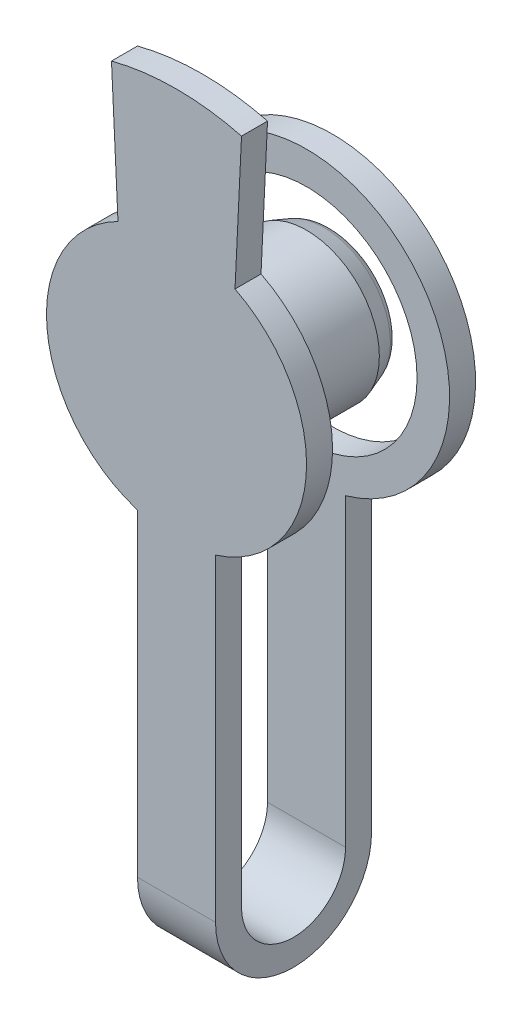
ISO-10303-21;
HEADER;
FILE_DESCRIPTION(('STEP AP214'),'2;1');
FILE_NAME('part.step','',(''),(''),'','','');
FILE_SCHEMA(('AUTOMOTIVE_DESIGN { 1 0 10303 214 1 1 1 1 }'));
ENDSEC;
DATA;
#1=APPLICATION_CONTEXT('core data for automotive mechanical design processes');
#2=APPLICATION_PROTOCOL_DEFINITION('international standard','automotive_design',2000,#1);
#3=PRODUCT_CONTEXT('',#1,'mechanical');
#4=PRODUCT('Part','Part','',(#3));
#5=PRODUCT_RELATED_PRODUCT_CATEGORY('part','',(#4));
#6=PRODUCT_DEFINITION_FORMATION('','',#4);
#7=PRODUCT_DEFINITION_CONTEXT('part definition',#1,'design');
#8=PRODUCT_DEFINITION('design','',#6,#7);
#9=PRODUCT_DEFINITION_SHAPE('','',#8);
#10=(LENGTH_UNIT() NAMED_UNIT(*) SI_UNIT(.MILLI.,.METRE.));
#11=(NAMED_UNIT(*) PLANE_ANGLE_UNIT() SI_UNIT($,.RADIAN.));
#12=(NAMED_UNIT(*) SI_UNIT($,.STERADIAN.) SOLID_ANGLE_UNIT());
#13=UNCERTAINTY_MEASURE_WITH_UNIT(LENGTH_MEASURE(1.E-05),#10,'distance_accuracy_value','');
#14=(GEOMETRIC_REPRESENTATION_CONTEXT(3) GLOBAL_UNCERTAINTY_ASSIGNED_CONTEXT((#13)) GLOBAL_UNIT_ASSIGNED_CONTEXT((#10,
#11,#12)) REPRESENTATION_CONTEXT('',''));
#15=CARTESIAN_POINT('',(0.,0.,0.));
#16=DIRECTION('',(0.,0.,1.));
#17=DIRECTION('',(1.,0.,0.));
#18=AXIS2_PLACEMENT_3D('',#15,#16,#17);
#19=CARTESIAN_POINT('',(0.,0.,5.));
#20=DIRECTION('',(0.,0.,-1.));
#21=DIRECTION('',(-1.,0.,0.));
#22=AXIS2_PLACEMENT_3D('',#19,#20,#21);
#23=CYLINDRICAL_SURFACE('',#22,5.);
#24=CARTESIAN_POINT('',(0.,0.,5.));
#25=DIRECTION('',(0.,0.,1.));
#26=DIRECTION('',(1.,0.,0.));
#27=AXIS2_PLACEMENT_3D('',#24,#25,#26);
#28=CIRCLE('',#27,5.);
#29=CARTESIAN_POINT('',(1.5,-4.76969600708473,5.));
#30=VERTEX_POINT('',#29);
#31=CARTESIAN_POINT('',(2.25,4.46514277487294,5.));
#32=VERTEX_POINT('',#31);
#33=EDGE_CURVE('E32',#30,#32,#28,.T.);
#34=ORIENTED_EDGE('',*,*,#33,.F.);
#35=DIRECTION('',(0.,0.,-1.));
#36=VECTOR('',#35,1.);
#37=CARTESIAN_POINT('',(1.5,-4.76969600708473,5.));
#38=LINE('',#37,#36);
#39=CARTESIAN_POINT('',(1.5,-4.76969600708473,4.));
#40=VERTEX_POINT('',#39);
#41=EDGE_CURVE('E176',#30,#40,#38,.T.);
#42=ORIENTED_EDGE('',*,*,#41,.T.);
#43=CARTESIAN_POINT('',(0.,0.,4.));
#44=DIRECTION('',(0.,0.,1.));
#45=DIRECTION('',(1.,0.,0.));
#46=AXIS2_PLACEMENT_3D('',#43,#44,#45);
#47=CIRCLE('',#46,5.);
#48=CARTESIAN_POINT('',(2.25,4.46514277487294,4.));
#49=VERTEX_POINT('',#48);
#50=EDGE_CURVE('E210',#40,#49,#47,.T.);
#51=ORIENTED_EDGE('',*,*,#50,.T.);
#52=DIRECTION('',(0.,0.,1.));
#53=VECTOR('',#52,1.);
#54=CARTESIAN_POINT('',(2.25,4.46514277487294,-3.45886348598372));
#55=LINE('',#54,#53);
#56=EDGE_CURVE('E197',#49,#32,#55,.T.);
#57=ORIENTED_EDGE('',*,*,#56,.T.);
#58=EDGE_LOOP('',(#34,#42,#51,#57));
#59=FACE_BOUND('',#58,.T.);
#60=ADVANCED_FACE('F17',(#59),#23,.T.);
#61=CARTESIAN_POINT('',(0.,0.,-1.));
#62=DIRECTION('',(0.,0.,1.));
#63=DIRECTION('',(1.,0.,0.));
#64=AXIS2_PLACEMENT_3D('',#61,#62,#63);
#65=CYLINDRICAL_SURFACE('',#64,2.8);
#66=CARTESIAN_POINT('',(0.,0.,0.));
#67=DIRECTION('',(0.,0.,1.));
#68=DIRECTION('',(1.,0.,0.));
#69=AXIS2_PLACEMENT_3D('',#66,#67,#68);
#70=CIRCLE('',#69,2.8);
#71=CARTESIAN_POINT('',(2.8,0.,0.));
#72=VERTEX_POINT('',#71);
#73=EDGE_CURVE('E222',#72,#72,#70,.T.);
#74=ORIENTED_EDGE('',*,*,#73,.T.);
#75=EDGE_LOOP('',(#74));
#76=FACE_BOUND('',#75,.T.);
#77=CARTESIAN_POINT('',(0.,0.,4.));
#78=DIRECTION('',(0.,0.,1.));
#79=DIRECTION('',(1.,0.,0.));
#80=AXIS2_PLACEMENT_3D('',#77,#78,#79);
#81=CIRCLE('',#80,2.8);
#82=CARTESIAN_POINT('',(2.8,0.,4.));
#83=VERTEX_POINT('',#82);
#84=EDGE_CURVE('E217',#83,#83,#81,.T.);
#85=ORIENTED_EDGE('',*,*,#84,.F.);
#86=EDGE_LOOP('',(#85));
#87=FACE_BOUND('',#86,.T.);
#88=ADVANCED_FACE('F244',(#76,#87),#65,.T.);
#89=CARTESIAN_POINT('',(0.,0.,-1.));
#90=DIRECTION('',(0.,0.,1.));
#91=DIRECTION('',(1.,0.,0.));
#92=AXIS2_PLACEMENT_3D('',#89,#90,#91);
#93=PLANE('',#92);
#94=CARTESIAN_POINT('',(0.,0.,-1.));
#95=DIRECTION('',(0.,0.,1.));
#96=DIRECTION('',(1.,0.,0.));
#97=AXIS2_PLACEMENT_3D('',#94,#95,#96);
#98=CIRCLE('',#97,2.08592599662894);
#99=CARTESIAN_POINT('',(2.08592599662894,0.,-1.));
#100=VERTEX_POINT('',#99);
#101=EDGE_CURVE('E25',#100,#100,#98,.F.);
#102=ORIENTED_EDGE('',*,*,#101,.T.);
#103=EDGE_LOOP('',(#102));
#104=FACE_BOUND('',#103,.T.);
#105=CARTESIAN_POINT('',(0.,0.,-1.));
#106=DIRECTION('',(0.,0.,1.));
#107=DIRECTION('',(1.,0.,0.));
#108=AXIS2_PLACEMENT_3D('',#105,#106,#107);
#109=CIRCLE('',#108,1.5);
#110=CARTESIAN_POINT('',(1.5,0.,-1.));
#111=VERTEX_POINT('',#110);
#112=EDGE_CURVE('E214',#111,#111,#109,.T.);
#113=ORIENTED_EDGE('',*,*,#112,.T.);
#114=EDGE_LOOP('',(#113));
#115=FACE_BOUND('',#114,.T.);
#116=ADVANCED_FACE('F226',(#104,#115),#93,.F.);
#117=CARTESIAN_POINT('',(0.,0.,-1.));
#118=DIRECTION('',(0.,0.,1.));
#119=DIRECTION('',(1.,0.,0.));
#120=AXIS2_PLACEMENT_3D('',#117,#118,#119);
#121=CYLINDRICAL_SURFACE('',#120,1.5);
#122=ORIENTED_EDGE('',*,*,#112,.F.);
#123=EDGE_LOOP('',(#122));
#124=FACE_BOUND('',#123,.T.);
#125=CARTESIAN_POINT('',(0.,0.,4.));
#126=DIRECTION('',(0.,0.,1.));
#127=DIRECTION('',(1.,0.,0.));
#128=AXIS2_PLACEMENT_3D('',#125,#126,#127);
#129=CIRCLE('',#128,1.5);
#130=CARTESIAN_POINT('',(1.5,0.,4.));
#131=VERTEX_POINT('',#130);
#132=EDGE_CURVE('E209',#131,#131,#129,.F.);
#133=ORIENTED_EDGE('',*,*,#132,.F.);
#134=EDGE_LOOP('',(#133));
#135=FACE_BOUND('',#134,.T.);
#136=ADVANCED_FACE('F270',(#124,#135),#121,.F.);
#137=CARTESIAN_POINT('',(0.,0.,4.));
#138=DIRECTION('',(0.,0.,1.));
#139=DIRECTION('',(1.,0.,0.));
#140=AXIS2_PLACEMENT_3D('',#137,#138,#139);
#141=PLANE('',#140);
#142=ORIENTED_EDGE('',*,*,#132,.T.);
#143=EDGE_LOOP('',(#142));
#144=FACE_BOUND('',#143,.T.);
#145=ADVANCED_FACE('F256',(#144),#141,.F.);
#146=CARTESIAN_POINT('',(-2.25,4.46514277487294,4.));
#147=VERTEX_POINT('',#146);
#148=CARTESIAN_POINT('',(-1.5,-4.76969600708473,4.));
#149=VERTEX_POINT('',#148);
#150=EDGE_CURVE('E211',#147,#149,#47,.T.);
#151=ORIENTED_EDGE('',*,*,#150,.T.);
#152=DIRECTION('',(0.,0.,-1.));
#153=VECTOR('',#152,1.);
#154=CARTESIAN_POINT('',(-1.5,-4.76969600708473,5.));
#155=LINE('',#154,#153);
#156=CARTESIAN_POINT('',(-1.5,-4.76969600708473,5.));
#157=VERTEX_POINT('',#156);
#158=EDGE_CURVE('E37',#149,#157,#155,.F.);
#159=ORIENTED_EDGE('',*,*,#158,.T.);
#160=CARTESIAN_POINT('',(-2.25,4.46514277487294,5.));
#161=VERTEX_POINT('',#160);
#162=EDGE_CURVE('E208',#161,#157,#28,.T.);
#163=ORIENTED_EDGE('',*,*,#162,.F.);
#164=DIRECTION('',(0.,0.,1.));
#165=VECTOR('',#164,1.);
#166=CARTESIAN_POINT('',(-2.25,4.46514277487294,-3.45886348598372));
#167=LINE('',#166,#165);
#168=EDGE_CURVE('E186',#147,#161,#167,.T.);
#169=ORIENTED_EDGE('',*,*,#168,.F.);
#170=EDGE_LOOP('',(#151,#159,#163,#169));
#171=FACE_BOUND('',#170,.T.);
#172=ADVANCED_FACE('F250',(#171),#23,.T.);
#173=CARTESIAN_POINT('',(0.,0.,5.));
#174=DIRECTION('',(0.,0.,1.));
#175=DIRECTION('',(1.,0.,0.));
#176=AXIS2_PLACEMENT_3D('',#173,#174,#175);
#177=PLANE('',#176);
#178=ORIENTED_EDGE('',*,*,#162,.T.);
#179=DIRECTION('',(0.,-1.,0.));
#180=VECTOR('',#179,1.);
#181=CARTESIAN_POINT('',(-1.5,-7.,5.));
#182=LINE('',#181,#180);
#183=CARTESIAN_POINT('',(-1.5,-17.,5.));
#184=VERTEX_POINT('',#183);
#185=EDGE_CURVE('E173',#157,#184,#182,.T.);
#186=ORIENTED_EDGE('',*,*,#185,.T.);
#187=DIRECTION('',(1.,0.,0.));
#188=VECTOR('',#187,1.);
#189=CARTESIAN_POINT('',(-16.2732867026942,-17.,5.));
#190=LINE('',#189,#188);
#191=CARTESIAN_POINT('',(1.5,-17.,5.));
#192=VERTEX_POINT('',#191);
#193=EDGE_CURVE('E150',#184,#192,#190,.T.);
#194=ORIENTED_EDGE('',*,*,#193,.T.);
#195=DIRECTION('',(0.,1.,0.));
#196=VECTOR('',#195,1.);
#197=CARTESIAN_POINT('',(1.5,-7.,5.));
#198=LINE('',#197,#196);
#199=EDGE_CURVE('E164',#192,#30,#198,.T.);
#200=ORIENTED_EDGE('',*,*,#199,.T.);
#201=ORIENTED_EDGE('',*,*,#33,.T.);
#202=DIRECTION('',(0.0478624456898062,0.998853936415425,0.));
#203=VECTOR('',#202,1.);
#204=CARTESIAN_POINT('',(2.25,4.46514277487294,5.));
#205=LINE('',#204,#203);
#206=CARTESIAN_POINT('',(2.5,9.68245836551854,5.));
#207=VERTEX_POINT('',#206);
#208=EDGE_CURVE('E181',#32,#207,#205,.T.);
#209=ORIENTED_EDGE('',*,*,#208,.T.);
#210=CARTESIAN_POINT('',(0.,0.,5.));
#211=DIRECTION('',(0.,0.,1.));
#212=DIRECTION('',(1.,0.,0.));
#213=AXIS2_PLACEMENT_3D('',#210,#211,#212);
#214=CIRCLE('',#213,10.);
#215=CARTESIAN_POINT('',(-2.5,9.68245836551854,5.));
#216=VERTEX_POINT('',#215);
#217=EDGE_CURVE('E192',#207,#216,#214,.T.);
#218=ORIENTED_EDGE('',*,*,#217,.T.);
#219=DIRECTION('',(0.0478624456898069,-0.998853936415425,0.));
#220=VECTOR('',#219,1.);
#221=CARTESIAN_POINT('',(-2.25,4.46514277487294,5.));
#222=LINE('',#221,#220);
#223=EDGE_CURVE('E191',#216,#161,#222,.T.);
#224=ORIENTED_EDGE('',*,*,#223,.T.);
#225=EDGE_LOOP('',(#178,#186,#194,#200,#201,#209,#218,#224));
#226=FACE_BOUND('',#225,.T.);
#227=ADVANCED_FACE('F260',(#226),#177,.T.);
#228=ORIENTED_EDGE('',*,*,#50,.F.);
#229=DIRECTION('',(0.,-1.,0.));
#230=VECTOR('',#229,1.);
#231=CARTESIAN_POINT('',(1.5,-7.,4.));
#232=LINE('',#231,#230);
#233=CARTESIAN_POINT('',(1.5,-17.,4.));
#234=VERTEX_POINT('',#233);
#235=EDGE_CURVE('E174',#40,#234,#232,.T.);
#236=ORIENTED_EDGE('',*,*,#235,.T.);
#237=DIRECTION('',(1.,0.,0.));
#238=VECTOR('',#237,1.);
#239=CARTESIAN_POINT('',(-16.2732867026942,-17.,4.));
#240=LINE('',#239,#238);
#241=CARTESIAN_POINT('',(-1.5,-17.,4.));
#242=VERTEX_POINT('',#241);
#243=EDGE_CURVE('E158',#242,#234,#240,.T.);
#244=ORIENTED_EDGE('',*,*,#243,.F.);
#245=DIRECTION('',(0.,1.,0.));
#246=VECTOR('',#245,1.);
#247=CARTESIAN_POINT('',(-1.5,-7.,4.));
#248=LINE('',#247,#246);
#249=EDGE_CURVE('E168',#242,#149,#248,.T.);
#250=ORIENTED_EDGE('',*,*,#249,.T.);
#251=ORIENTED_EDGE('',*,*,#150,.F.);
#252=DIRECTION('',(-0.0478624456898069,0.998853936415425,0.));
#253=VECTOR('',#252,1.);
#254=CARTESIAN_POINT('',(-2.25,4.46514277487294,4.));
#255=LINE('',#254,#253);
#256=CARTESIAN_POINT('',(-2.5,9.68245836551854,4.));
#257=VERTEX_POINT('',#256);
#258=EDGE_CURVE('E184',#147,#257,#255,.T.);
#259=ORIENTED_EDGE('',*,*,#258,.T.);
#260=CARTESIAN_POINT('',(0.,0.,4.));
#261=DIRECTION('',(0.,0.,1.));
#262=DIRECTION('',(1.,0.,0.));
#263=AXIS2_PLACEMENT_3D('',#260,#261,#262);
#264=CIRCLE('',#263,10.);
#265=CARTESIAN_POINT('',(2.5,9.68245836551854,4.));
#266=VERTEX_POINT('',#265);
#267=EDGE_CURVE('E183',#257,#266,#264,.F.);
#268=ORIENTED_EDGE('',*,*,#267,.T.);
#269=DIRECTION('',(-0.0478624456898062,-0.998853936415425,0.));
#270=VECTOR('',#269,1.);
#271=CARTESIAN_POINT('',(2.25,4.46514277487294,4.));
#272=LINE('',#271,#270);
#273=EDGE_CURVE('E187',#266,#49,#272,.T.);
#274=ORIENTED_EDGE('',*,*,#273,.T.);
#275=EDGE_LOOP('',(#228,#236,#244,#250,#251,#259,#268,#274));
#276=FACE_BOUND('',#275,.T.);
#277=ORIENTED_EDGE('',*,*,#84,.T.);
#278=EDGE_LOOP('',(#277));
#279=FACE_BOUND('',#278,.T.);
#280=ADVANCED_FACE('F262',(#276,#279),#141,.F.);
#281=CARTESIAN_POINT('',(-2.25,4.46514277487294,-3.45886348598372));
#282=DIRECTION('',(-0.998853936415425,-0.0478624456898069,0.));
#283=DIRECTION('',(0.0478624456898069,-0.998853936415425,0.));
#284=AXIS2_PLACEMENT_3D('',#281,#282,#283);
#285=PLANE('',#284);
#286=ORIENTED_EDGE('',*,*,#258,.F.);
#287=ORIENTED_EDGE('',*,*,#168,.T.);
#288=ORIENTED_EDGE('',*,*,#223,.F.);
#289=DIRECTION('',(0.,0.,1.));
#290=VECTOR('',#289,1.);
#291=CARTESIAN_POINT('',(-2.5,9.68245836551854,-3.45886348598372));
#292=LINE('',#291,#290);
#293=EDGE_CURVE('E199',#257,#216,#292,.T.);
#294=ORIENTED_EDGE('',*,*,#293,.F.);
#295=EDGE_LOOP('',(#286,#287,#288,#294));
#296=FACE_BOUND('',#295,.T.);
#297=ADVANCED_FACE('F290',(#296),#285,.T.);
#298=CARTESIAN_POINT('',(0.,0.,-3.45886348598372));
#299=DIRECTION('',(0.,0.,1.));
#300=DIRECTION('',(1.,0.,0.));
#301=AXIS2_PLACEMENT_3D('',#298,#299,#300);
#302=CYLINDRICAL_SURFACE('',#301,10.);
#303=ORIENTED_EDGE('',*,*,#267,.F.);
#304=ORIENTED_EDGE('',*,*,#293,.T.);
#305=ORIENTED_EDGE('',*,*,#217,.F.);
#306=DIRECTION('',(0.,0.,1.));
#307=VECTOR('',#306,1.);
#308=CARTESIAN_POINT('',(2.5,9.68245836551854,-3.45886348598372));
#309=LINE('',#308,#307);
#310=EDGE_CURVE('E205',#266,#207,#309,.T.);
#311=ORIENTED_EDGE('',*,*,#310,.F.);
#312=EDGE_LOOP('',(#303,#304,#305,#311));
#313=FACE_BOUND('',#312,.T.);
#314=ADVANCED_FACE('F292',(#313),#302,.T.);
#315=CARTESIAN_POINT('',(2.25,4.46514277487294,-3.45886348598372));
#316=DIRECTION('',(0.998853936415425,-0.0478624456898062,0.));
#317=DIRECTION('',(0.0478624456898062,0.998853936415425,0.));
#318=AXIS2_PLACEMENT_3D('',#315,#316,#317);
#319=PLANE('',#318);
#320=ORIENTED_EDGE('',*,*,#273,.F.);
#321=ORIENTED_EDGE('',*,*,#310,.T.);
#322=ORIENTED_EDGE('',*,*,#208,.F.);
#323=ORIENTED_EDGE('',*,*,#56,.F.);
#324=EDGE_LOOP('',(#320,#321,#322,#323));
#325=FACE_BOUND('',#324,.T.);
#326=ADVANCED_FACE('F241',(#325),#319,.T.);
#327=CARTESIAN_POINT('',(0.,0.,0.));
#328=DIRECTION('',(0.,0.,1.));
#329=DIRECTION('',(1.,0.,0.));
#330=AXIS2_PLACEMENT_3D('',#327,#328,#329);
#331=CONICAL_SURFACE('',#330,2.8,0.349065850398863);
#332=CARTESIAN_POINT('',(0.,0.,-0.671010071662833));
#333=DIRECTION('',(0.,0.,1.));
#334=DIRECTION('',(1.,0.,0.));
#335=AXIS2_PLACEMENT_3D('',#332,#333,#334);
#336=CIRCLE('',#335,2.55577230702189);
#337=CARTESIAN_POINT('',(2.55577230702189,0.,-0.671010071662833));
#338=VERTEX_POINT('',#337);
#339=EDGE_CURVE('E11',#338,#338,#336,.T.);
#340=ORIENTED_EDGE('',*,*,#339,.T.);
#341=EDGE_LOOP('',(#340));
#342=FACE_BOUND('',#341,.T.);
#343=ORIENTED_EDGE('',*,*,#73,.F.);
#344=EDGE_LOOP('',(#343));
#345=FACE_BOUND('',#344,.T.);
#346=ADVANCED_FACE('F233',(#342,#345),#331,.T.);
#347=CARTESIAN_POINT('',(0.,0.,-0.5));
#348=DIRECTION('',(0.,0.,1.));
#349=DIRECTION('',(1.,0.,0.));
#350=AXIS2_PLACEMENT_3D('',#347,#348,#349);
#351=TOROIDAL_SURFACE('',#350,2.08592599662894,0.5);
#352=ORIENTED_EDGE('',*,*,#339,.F.);
#353=EDGE_LOOP('',(#352));
#354=FACE_BOUND('',#353,.T.);
#355=ORIENTED_EDGE('',*,*,#101,.F.);
#356=EDGE_LOOP('',(#355));
#357=FACE_BOUND('',#356,.T.);
#358=ADVANCED_FACE('F19',(#354,#357),#351,.T.);
#359=CARTESIAN_POINT('',(1.5,-7.,-1.));
#360=DIRECTION('',(1.,0.,0.));
#361=DIRECTION('',(0.,0.,-1.));
#362=AXIS2_PLACEMENT_3D('',#359,#360,#361);
#363=PLANE('',#362);
#364=ORIENTED_EDGE('',*,*,#41,.F.);
#365=ORIENTED_EDGE('',*,*,#199,.F.);
#366=CARTESIAN_POINT('',(1.5,-17.,2.));
#367=DIRECTION('',(1.,0.,0.));
#368=DIRECTION('',(0.,0.,-1.));
#369=AXIS2_PLACEMENT_3D('',#366,#367,#368);
#370=CIRCLE('',#369,3.);
#371=CARTESIAN_POINT('',(1.5,-17.,-1.));
#372=VERTEX_POINT('',#371);
#373=EDGE_CURVE('E127',#192,#372,#370,.T.);
#374=ORIENTED_EDGE('',*,*,#373,.T.);
#375=DIRECTION('',(0.,1.,0.));
#376=VECTOR('',#375,1.);
#377=CARTESIAN_POINT('',(1.5,-6.5,-1.));
#378=LINE('',#377,#376);
#379=CARTESIAN_POINT('',(1.5,-5.29150262212918,-1.));
#380=VERTEX_POINT('',#379);
#381=EDGE_CURVE('E151',#372,#380,#378,.T.);
#382=ORIENTED_EDGE('',*,*,#381,.T.);
#383=DIRECTION('',(0.,0.,1.));
#384=VECTOR('',#383,1.);
#385=CARTESIAN_POINT('',(1.5,-5.29150262212918,-1.));
#386=LINE('',#385,#384);
#387=CARTESIAN_POINT('',(1.5,-5.29150262212918,0.));
#388=VERTEX_POINT('',#387);
#389=EDGE_CURVE('E128',#380,#388,#386,.T.);
#390=ORIENTED_EDGE('',*,*,#389,.T.);
#391=DIRECTION('',(0.,-1.,0.));
#392=VECTOR('',#391,1.);
#393=CARTESIAN_POINT('',(1.5,-6.5,0.));
#394=LINE('',#393,#392);
#395=CARTESIAN_POINT('',(1.5,-17.,0.));
#396=VERTEX_POINT('',#395);
#397=EDGE_CURVE('E146',#388,#396,#394,.T.);
#398=ORIENTED_EDGE('',*,*,#397,.T.);
#399=CARTESIAN_POINT('',(1.5,-17.,2.));
#400=DIRECTION('',(-1.,0.,0.));
#401=DIRECTION('',(0.,0.,-1.));
#402=AXIS2_PLACEMENT_3D('',#399,#400,#401);
#403=CIRCLE('',#402,2.);
#404=EDGE_CURVE('E145',#396,#234,#403,.T.);
#405=ORIENTED_EDGE('',*,*,#404,.T.);
#406=ORIENTED_EDGE('',*,*,#235,.F.);
#407=EDGE_LOOP('',(#364,#365,#374,#382,#390,#398,#405,#406));
#408=FACE_BOUND('',#407,.T.);
#409=ADVANCED_FACE('F230',(#408),#363,.T.);
#410=CARTESIAN_POINT('',(-1.5,-7.,-1.));
#411=DIRECTION('',(-1.,0.,0.));
#412=DIRECTION('',(0.,0.,1.));
#413=AXIS2_PLACEMENT_3D('',#410,#411,#412);
#414=PLANE('',#413);
#415=ORIENTED_EDGE('',*,*,#158,.F.);
#416=ORIENTED_EDGE('',*,*,#249,.F.);
#417=CARTESIAN_POINT('',(-1.5,-17.,2.));
#418=DIRECTION('',(-1.,0.,0.));
#419=DIRECTION('',(0.,0.,1.));
#420=AXIS2_PLACEMENT_3D('',#417,#418,#419);
#421=CIRCLE('',#420,2.);
#422=CARTESIAN_POINT('',(-1.5,-17.,0.));
#423=VERTEX_POINT('',#422);
#424=EDGE_CURVE('E154',#423,#242,#421,.T.);
#425=ORIENTED_EDGE('',*,*,#424,.F.);
#426=DIRECTION('',(0.,-1.,0.));
#427=VECTOR('',#426,1.);
#428=CARTESIAN_POINT('',(-1.5,-6.5,0.));
#429=LINE('',#428,#427);
#430=CARTESIAN_POINT('',(-1.5,-5.29150262212918,0.));
#431=VERTEX_POINT('',#430);
#432=EDGE_CURVE('E119',#431,#423,#429,.T.);
#433=ORIENTED_EDGE('',*,*,#432,.F.);
#434=DIRECTION('',(0.,0.,1.));
#435=VECTOR('',#434,1.);
#436=CARTESIAN_POINT('',(-1.5,-5.29150262212918,-1.));
#437=LINE('',#436,#435);
#438=CARTESIAN_POINT('',(-1.5,-5.29150262212918,-1.));
#439=VERTEX_POINT('',#438);
#440=EDGE_CURVE('E121',#431,#439,#437,.F.);
#441=ORIENTED_EDGE('',*,*,#440,.T.);
#442=DIRECTION('',(0.,1.,0.));
#443=VECTOR('',#442,1.);
#444=CARTESIAN_POINT('',(-1.5,-6.5,-1.));
#445=LINE('',#444,#443);
#446=CARTESIAN_POINT('',(-1.5,-17.,-1.));
#447=VERTEX_POINT('',#446);
#448=EDGE_CURVE('E110',#447,#439,#445,.T.);
#449=ORIENTED_EDGE('',*,*,#448,.F.);
#450=CARTESIAN_POINT('',(-1.5,-17.,2.));
#451=DIRECTION('',(-1.,0.,0.));
#452=DIRECTION('',(0.,0.,1.));
#453=AXIS2_PLACEMENT_3D('',#450,#451,#452);
#454=CIRCLE('',#453,3.);
#455=EDGE_CURVE('E161',#184,#447,#454,.F.);
#456=ORIENTED_EDGE('',*,*,#455,.F.);
#457=ORIENTED_EDGE('',*,*,#185,.F.);
#458=EDGE_LOOP('',(#415,#416,#425,#433,#441,#449,#456,#457));
#459=FACE_BOUND('',#458,.T.);
#460=ADVANCED_FACE('F135',(#459),#414,.T.);
#461=CARTESIAN_POINT('',(-16.2732867026942,-17.,2.));
#462=DIRECTION('',(1.,0.,0.));
#463=DIRECTION('',(0.,0.,-1.));
#464=AXIS2_PLACEMENT_3D('',#461,#462,#463);
#465=CYLINDRICAL_SURFACE('',#464,3.);
#466=ORIENTED_EDGE('',*,*,#193,.F.);
#467=ORIENTED_EDGE('',*,*,#455,.T.);
#468=DIRECTION('',(1.,0.,0.));
#469=VECTOR('',#468,1.);
#470=CARTESIAN_POINT('',(-16.2732867026942,-17.,-1.));
#471=LINE('',#470,#469);
#472=EDGE_CURVE('E114',#447,#372,#471,.T.);
#473=ORIENTED_EDGE('',*,*,#472,.T.);
#474=ORIENTED_EDGE('',*,*,#373,.F.);
#475=EDGE_LOOP('',(#466,#467,#473,#474));
#476=FACE_BOUND('',#475,.T.);
#477=ADVANCED_FACE('F288',(#476),#465,.T.);
#478=CARTESIAN_POINT('',(-16.2732867026942,-6.5,-1.));
#479=DIRECTION('',(0.,0.,-1.));
#480=DIRECTION('',(-1.,0.,0.));
#481=AXIS2_PLACEMENT_3D('',#478,#479,#480);
#482=PLANE('',#481);
#483=ORIENTED_EDGE('',*,*,#472,.F.);
#484=ORIENTED_EDGE('',*,*,#448,.T.);
#485=CARTESIAN_POINT('',(0.,0.,-1.));
#486=DIRECTION('',(0.,0.,1.));
#487=DIRECTION('',(1.,0.,0.));
#488=AXIS2_PLACEMENT_3D('',#485,#486,#487);
#489=CIRCLE('',#488,5.5);
#490=EDGE_CURVE('E115',#380,#439,#489,.T.);
#491=ORIENTED_EDGE('',*,*,#490,.F.);
#492=ORIENTED_EDGE('',*,*,#381,.F.);
#493=EDGE_LOOP('',(#483,#484,#491,#492));
#494=FACE_BOUND('',#493,.T.);
#495=CARTESIAN_POINT('',(0.,0.,-1.));
#496=DIRECTION('',(0.,0.,1.));
#497=DIRECTION('',(1.,0.,0.));
#498=AXIS2_PLACEMENT_3D('',#495,#496,#497);
#499=CIRCLE('',#498,4.25);
#500=CARTESIAN_POINT('',(4.25,0.,-1.));
#501=VERTEX_POINT('',#500);
#502=EDGE_CURVE('E139',#501,#501,#499,.T.);
#503=ORIENTED_EDGE('',*,*,#502,.T.);
#504=EDGE_LOOP('',(#503));
#505=FACE_BOUND('',#504,.T.);
#506=ADVANCED_FACE('F108',(#494,#505),#482,.T.);
#507=CARTESIAN_POINT('',(-16.2732867026942,-6.5,0.));
#508=DIRECTION('',(0.,0.,1.));
#509=DIRECTION('',(1.,0.,0.));
#510=AXIS2_PLACEMENT_3D('',#507,#508,#509);
#511=PLANE('',#510);
#512=ORIENTED_EDGE('',*,*,#397,.F.);
#513=CARTESIAN_POINT('',(0.,0.,0.));
#514=DIRECTION('',(0.,0.,1.));
#515=DIRECTION('',(1.,0.,0.));
#516=AXIS2_PLACEMENT_3D('',#513,#514,#515);
#517=CIRCLE('',#516,5.5);
#518=EDGE_CURVE('E129',#388,#431,#517,.T.);
#519=ORIENTED_EDGE('',*,*,#518,.T.);
#520=ORIENTED_EDGE('',*,*,#432,.T.);
#521=DIRECTION('',(1.,0.,0.));
#522=VECTOR('',#521,1.);
#523=CARTESIAN_POINT('',(-16.2732867026942,-17.,0.));
#524=LINE('',#523,#522);
#525=EDGE_CURVE('E157',#423,#396,#524,.T.);
#526=ORIENTED_EDGE('',*,*,#525,.T.);
#527=EDGE_LOOP('',(#512,#519,#520,#526));
#528=FACE_BOUND('',#527,.T.);
#529=CARTESIAN_POINT('',(0.,0.,0.));
#530=DIRECTION('',(0.,0.,1.));
#531=DIRECTION('',(1.,0.,0.));
#532=AXIS2_PLACEMENT_3D('',#529,#530,#531);
#533=CIRCLE('',#532,4.25);
#534=CARTESIAN_POINT('',(4.25,0.,0.));
#535=VERTEX_POINT('',#534);
#536=EDGE_CURVE('E134',#535,#535,#533,.T.);
#537=ORIENTED_EDGE('',*,*,#536,.F.);
#538=EDGE_LOOP('',(#537));
#539=FACE_BOUND('',#538,.T.);
#540=ADVANCED_FACE('F281',(#528,#539),#511,.T.);
#541=CARTESIAN_POINT('',(-16.2732867026942,-17.,2.));
#542=DIRECTION('',(1.,0.,0.));
#543=DIRECTION('',(0.,0.,-1.));
#544=AXIS2_PLACEMENT_3D('',#541,#542,#543);
#545=CYLINDRICAL_SURFACE('',#544,2.);
#546=ORIENTED_EDGE('',*,*,#525,.F.);
#547=ORIENTED_EDGE('',*,*,#424,.T.);
#548=ORIENTED_EDGE('',*,*,#243,.T.);
#549=ORIENTED_EDGE('',*,*,#404,.F.);
#550=EDGE_LOOP('',(#546,#547,#548,#549));
#551=FACE_BOUND('',#550,.T.);
#552=ADVANCED_FACE('F276',(#551),#545,.F.);
#553=CARTESIAN_POINT('',(0.,0.,-1.));
#554=DIRECTION('',(0.,0.,1.));
#555=DIRECTION('',(1.,0.,0.));
#556=AXIS2_PLACEMENT_3D('',#553,#554,#555);
#557=CYLINDRICAL_SURFACE('',#556,5.5);
#558=ORIENTED_EDGE('',*,*,#389,.F.);
#559=ORIENTED_EDGE('',*,*,#490,.T.);
#560=ORIENTED_EDGE('',*,*,#440,.F.);
#561=ORIENTED_EDGE('',*,*,#518,.F.);
#562=EDGE_LOOP('',(#558,#559,#560,#561));
#563=FACE_BOUND('',#562,.T.);
#564=ADVANCED_FACE('F122',(#563),#557,.T.);
#565=CARTESIAN_POINT('',(0.,0.,-1.));
#566=DIRECTION('',(0.,0.,1.));
#567=DIRECTION('',(1.,0.,0.));
#568=AXIS2_PLACEMENT_3D('',#565,#566,#567);
#569=CYLINDRICAL_SURFACE('',#568,4.25);
#570=ORIENTED_EDGE('',*,*,#502,.F.);
#571=EDGE_LOOP('',(#570));
#572=FACE_BOUND('',#571,.T.);
#573=ORIENTED_EDGE('',*,*,#536,.T.);
#574=EDGE_LOOP('',(#573));
#575=FACE_BOUND('',#574,.T.);
#576=ADVANCED_FACE('F328',(#572,#575),#569,.F.);
#577=CLOSED_SHELL('',(#60,#88,#116,#136,#145,#172,#227,#280,#297,#314,#326,#346,#358,#409,#460,
#477,#506,#540,#552,#564,#576));
#578=MANIFOLD_SOLID_BREP('B1',#577);
#579=ADVANCED_BREP_SHAPE_REPRESENTATION('',(#18,#578),#14);
#580=SHAPE_DEFINITION_REPRESENTATION(#9,#579);
ENDSEC;
END-ISO-10303-21;
